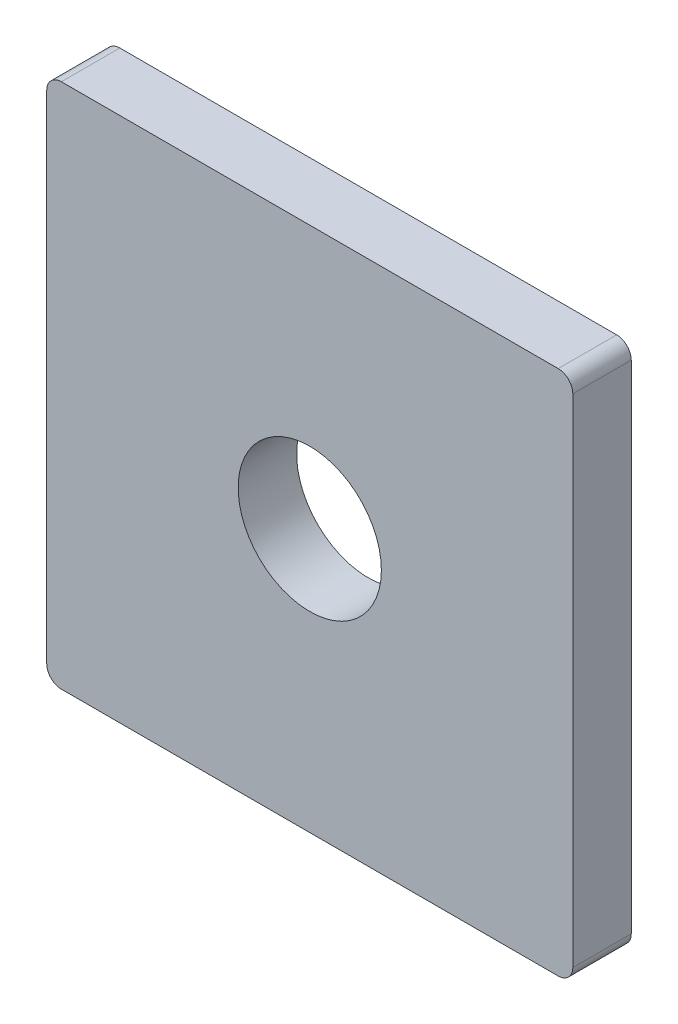
ISO-10303-21;
HEADER;
FILE_DESCRIPTION(('STEP AP214'),'2;1');
FILE_NAME('part.step','',(''),(''),'','','');
FILE_SCHEMA(('AUTOMOTIVE_DESIGN { 1 0 10303 214 1 1 1 1 }'));
ENDSEC;
DATA;
#1=APPLICATION_CONTEXT('core data for automotive mechanical design processes');
#2=APPLICATION_PROTOCOL_DEFINITION('international standard','automotive_design',2000,#1);
#3=PRODUCT_CONTEXT('',#1,'mechanical');
#4=PRODUCT('Part','Part','',(#3));
#5=PRODUCT_RELATED_PRODUCT_CATEGORY('part','',(#4));
#6=PRODUCT_DEFINITION_FORMATION('','',#4);
#7=PRODUCT_DEFINITION_CONTEXT('part definition',#1,'design');
#8=PRODUCT_DEFINITION('design','',#6,#7);
#9=PRODUCT_DEFINITION_SHAPE('','',#8);
#10=(LENGTH_UNIT() NAMED_UNIT(*) SI_UNIT(.MILLI.,.METRE.));
#11=(NAMED_UNIT(*) PLANE_ANGLE_UNIT() SI_UNIT($,.RADIAN.));
#12=(NAMED_UNIT(*) SI_UNIT($,.STERADIAN.) SOLID_ANGLE_UNIT());
#13=UNCERTAINTY_MEASURE_WITH_UNIT(LENGTH_MEASURE(1.E-05),#10,'distance_accuracy_value','');
#14=(GEOMETRIC_REPRESENTATION_CONTEXT(3) GLOBAL_UNCERTAINTY_ASSIGNED_CONTEXT((#13)) GLOBAL_UNIT_ASSIGNED_CONTEXT((#10,
#11,#12)) REPRESENTATION_CONTEXT('',''));
#15=CARTESIAN_POINT('',(0.,0.,0.));
#16=DIRECTION('',(0.,0.,1.));
#17=DIRECTION('',(1.,0.,0.));
#18=AXIS2_PLACEMENT_3D('',#15,#16,#17);
#19=CARTESIAN_POINT('',(0.,0.,2.));
#20=DIRECTION('',(0.,0.,1.));
#21=DIRECTION('',(1.,0.,0.));
#22=AXIS2_PLACEMENT_3D('',#19,#20,#21);
#23=PLANE('',#22);
#24=DIRECTION('',(0.,-1.,0.));
#25=VECTOR('',#24,1.);
#26=CARTESIAN_POINT('',(-9.,9.,2.));
#27=LINE('',#26,#25);
#28=CARTESIAN_POINT('',(-9.,8.5,2.));
#29=VERTEX_POINT('',#28);
#30=CARTESIAN_POINT('',(-9.,-8.5,2.));
#31=VERTEX_POINT('',#30);
#32=EDGE_CURVE('E171',#29,#31,#27,.T.);
#33=ORIENTED_EDGE('',*,*,#32,.T.);
#34=CARTESIAN_POINT('',(-8.5,-8.5,2.));
#35=DIRECTION('',(0.,0.,1.));
#36=DIRECTION('',(1.,0.,0.));
#37=AXIS2_PLACEMENT_3D('',#34,#35,#36);
#38=CIRCLE('',#37,0.5);
#39=CARTESIAN_POINT('',(-8.5,-9.,2.));
#40=VERTEX_POINT('',#39);
#41=EDGE_CURVE('E148',#31,#40,#38,.T.);
#42=ORIENTED_EDGE('',*,*,#41,.T.);
#43=DIRECTION('',(1.,0.,0.));
#44=VECTOR('',#43,1.);
#45=CARTESIAN_POINT('',(-9.,-9.,2.));
#46=LINE('',#45,#44);
#47=CARTESIAN_POINT('',(8.5,-9.,2.));
#48=VERTEX_POINT('',#47);
#49=EDGE_CURVE('E119',#40,#48,#46,.T.);
#50=ORIENTED_EDGE('',*,*,#49,.T.);
#51=CARTESIAN_POINT('',(8.5,-8.5,2.));
#52=DIRECTION('',(0.,0.,1.));
#53=DIRECTION('',(1.,0.,0.));
#54=AXIS2_PLACEMENT_3D('',#51,#52,#53);
#55=CIRCLE('',#54,0.5);
#56=CARTESIAN_POINT('',(9.,-8.5,2.));
#57=VERTEX_POINT('',#56);
#58=EDGE_CURVE('E144',#48,#57,#55,.T.);
#59=ORIENTED_EDGE('',*,*,#58,.T.);
#60=DIRECTION('',(0.,1.,0.));
#61=VECTOR('',#60,1.);
#62=CARTESIAN_POINT('',(9.,9.,2.));
#63=LINE('',#62,#61);
#64=CARTESIAN_POINT('',(9.,8.5,2.));
#65=VERTEX_POINT('',#64);
#66=EDGE_CURVE('E127',#57,#65,#63,.T.);
#67=ORIENTED_EDGE('',*,*,#66,.T.);
#68=CARTESIAN_POINT('',(8.49999999999999,8.5,2.));
#69=DIRECTION('',(0.,0.,1.));
#70=DIRECTION('',(1.,0.,0.));
#71=AXIS2_PLACEMENT_3D('',#68,#69,#70);
#72=CIRCLE('',#71,0.5);
#73=CARTESIAN_POINT('',(8.49999999999999,9.,2.));
#74=VERTEX_POINT('',#73);
#75=EDGE_CURVE('E54',#65,#74,#72,.T.);
#76=ORIENTED_EDGE('',*,*,#75,.T.);
#77=DIRECTION('',(-1.,0.,0.));
#78=VECTOR('',#77,1.);
#79=CARTESIAN_POINT('',(-9.,9.,2.));
#80=LINE('',#79,#78);
#81=CARTESIAN_POINT('',(-8.5,9.,2.));
#82=VERTEX_POINT('',#81);
#83=EDGE_CURVE('E130',#74,#82,#80,.T.);
#84=ORIENTED_EDGE('',*,*,#83,.T.);
#85=CARTESIAN_POINT('',(-8.5,8.5,2.));
#86=DIRECTION('',(0.,0.,1.));
#87=DIRECTION('',(1.,0.,0.));
#88=AXIS2_PLACEMENT_3D('',#85,#86,#87);
#89=CIRCLE('',#88,0.5);
#90=EDGE_CURVE('E146',#82,#29,#89,.T.);
#91=ORIENTED_EDGE('',*,*,#90,.T.);
#92=EDGE_LOOP('',(#33,#42,#50,#59,#67,#76,#84,#91));
#93=FACE_BOUND('',#92,.T.);
#94=CARTESIAN_POINT('',(0.,0.,2.));
#95=DIRECTION('',(0.,0.,1.));
#96=DIRECTION('',(1.,0.,0.));
#97=AXIS2_PLACEMENT_3D('',#94,#95,#96);
#98=CIRCLE('',#97,2.45);
#99=CARTESIAN_POINT('',(2.45,0.,2.));
#100=VERTEX_POINT('',#99);
#101=EDGE_CURVE('E167',#100,#100,#98,.T.);
#102=ORIENTED_EDGE('',*,*,#101,.F.);
#103=EDGE_LOOP('',(#102));
#104=FACE_BOUND('',#103,.T.);
#105=ADVANCED_FACE('F32',(#93,#104),#23,.T.);
#106=CARTESIAN_POINT('',(0.,0.,0.));
#107=DIRECTION('',(0.,0.,1.));
#108=DIRECTION('',(1.,0.,0.));
#109=AXIS2_PLACEMENT_3D('',#106,#107,#108);
#110=PLANE('',#109);
#111=DIRECTION('',(1.,0.,0.));
#112=VECTOR('',#111,1.);
#113=CARTESIAN_POINT('',(-9.,-9.,0.));
#114=LINE('',#113,#112);
#115=CARTESIAN_POINT('',(-8.5,-9.,0.));
#116=VERTEX_POINT('',#115);
#117=CARTESIAN_POINT('',(8.5,-9.,0.));
#118=VERTEX_POINT('',#117);
#119=EDGE_CURVE('E116',#116,#118,#114,.T.);
#120=ORIENTED_EDGE('',*,*,#119,.F.);
#121=CARTESIAN_POINT('',(-8.5,-8.5,0.));
#122=DIRECTION('',(0.,0.,1.));
#123=DIRECTION('',(1.,0.,0.));
#124=AXIS2_PLACEMENT_3D('',#121,#122,#123);
#125=CIRCLE('',#124,0.5);
#126=CARTESIAN_POINT('',(-9.,-8.5,0.));
#127=VERTEX_POINT('',#126);
#128=EDGE_CURVE('E99',#116,#127,#125,.F.);
#129=ORIENTED_EDGE('',*,*,#128,.T.);
#130=DIRECTION('',(0.,-1.,0.));
#131=VECTOR('',#130,1.);
#132=CARTESIAN_POINT('',(-9.,9.,0.));
#133=LINE('',#132,#131);
#134=CARTESIAN_POINT('',(-9.,8.5,0.));
#135=VERTEX_POINT('',#134);
#136=EDGE_CURVE('E128',#135,#127,#133,.T.);
#137=ORIENTED_EDGE('',*,*,#136,.F.);
#138=CARTESIAN_POINT('',(-8.5,8.5,0.));
#139=DIRECTION('',(0.,0.,1.));
#140=DIRECTION('',(1.,0.,0.));
#141=AXIS2_PLACEMENT_3D('',#138,#139,#140);
#142=CIRCLE('',#141,0.5);
#143=CARTESIAN_POINT('',(-8.5,9.,0.));
#144=VERTEX_POINT('',#143);
#145=EDGE_CURVE('E110',#135,#144,#142,.F.);
#146=ORIENTED_EDGE('',*,*,#145,.T.);
#147=DIRECTION('',(-1.,0.,0.));
#148=VECTOR('',#147,1.);
#149=CARTESIAN_POINT('',(-9.,9.,0.));
#150=LINE('',#149,#148);
#151=CARTESIAN_POINT('',(8.49999999999999,9.,0.));
#152=VERTEX_POINT('',#151);
#153=EDGE_CURVE('E132',#152,#144,#150,.T.);
#154=ORIENTED_EDGE('',*,*,#153,.F.);
#155=CARTESIAN_POINT('',(8.49999999999999,8.5,0.));
#156=DIRECTION('',(0.,0.,1.));
#157=DIRECTION('',(1.,0.,0.));
#158=AXIS2_PLACEMENT_3D('',#155,#156,#157);
#159=CIRCLE('',#158,0.5);
#160=CARTESIAN_POINT('',(9.,8.5,0.));
#161=VERTEX_POINT('',#160);
#162=EDGE_CURVE('E120',#152,#161,#159,.F.);
#163=ORIENTED_EDGE('',*,*,#162,.T.);
#164=DIRECTION('',(0.,1.,0.));
#165=VECTOR('',#164,1.);
#166=CARTESIAN_POINT('',(9.,9.,0.));
#167=LINE('',#166,#165);
#168=CARTESIAN_POINT('',(9.,-8.5,0.));
#169=VERTEX_POINT('',#168);
#170=EDGE_CURVE('E159',#169,#161,#167,.T.);
#171=ORIENTED_EDGE('',*,*,#170,.F.);
#172=CARTESIAN_POINT('',(8.5,-8.5,0.));
#173=DIRECTION('',(0.,0.,1.));
#174=DIRECTION('',(1.,0.,0.));
#175=AXIS2_PLACEMENT_3D('',#172,#173,#174);
#176=CIRCLE('',#175,0.5);
#177=EDGE_CURVE('E126',#169,#118,#176,.F.);
#178=ORIENTED_EDGE('',*,*,#177,.T.);
#179=EDGE_LOOP('',(#120,#129,#137,#146,#154,#163,#171,#178));
#180=FACE_BOUND('',#179,.T.);
#181=CARTESIAN_POINT('',(0.,0.,0.));
#182=DIRECTION('',(0.,0.,1.));
#183=DIRECTION('',(1.,0.,0.));
#184=AXIS2_PLACEMENT_3D('',#181,#182,#183);
#185=CIRCLE('',#184,2.45);
#186=CARTESIAN_POINT('',(2.45,0.,0.));
#187=VERTEX_POINT('',#186);
#188=EDGE_CURVE('E174',#187,#187,#185,.T.);
#189=ORIENTED_EDGE('',*,*,#188,.T.);
#190=EDGE_LOOP('',(#189));
#191=FACE_BOUND('',#190,.T.);
#192=ADVANCED_FACE('F123',(#180,#191),#110,.F.);
#193=CARTESIAN_POINT('',(9.,9.,2.));
#194=DIRECTION('',(-1.,0.,0.));
#195=DIRECTION('',(0.,-1.,0.));
#196=AXIS2_PLACEMENT_3D('',#193,#194,#195);
#197=PLANE('',#196);
#198=ORIENTED_EDGE('',*,*,#66,.F.);
#199=DIRECTION('',(0.,0.,-1.));
#200=VECTOR('',#199,1.);
#201=CARTESIAN_POINT('',(9.,-8.5,2.));
#202=LINE('',#201,#200);
#203=EDGE_CURVE('E11',#57,#169,#202,.T.);
#204=ORIENTED_EDGE('',*,*,#203,.T.);
#205=ORIENTED_EDGE('',*,*,#170,.T.);
#206=DIRECTION('',(0.,0.,-1.));
#207=VECTOR('',#206,1.);
#208=CARTESIAN_POINT('',(9.,8.5,2.));
#209=LINE('',#208,#207);
#210=EDGE_CURVE('E40',#161,#65,#209,.F.);
#211=ORIENTED_EDGE('',*,*,#210,.T.);
#212=EDGE_LOOP('',(#198,#204,#205,#211));
#213=FACE_BOUND('',#212,.T.);
#214=ADVANCED_FACE('F157',(#213),#197,.F.);
#215=CARTESIAN_POINT('',(-9.,9.,2.));
#216=DIRECTION('',(0.,-1.,0.));
#217=DIRECTION('',(0.,0.,-1.));
#218=AXIS2_PLACEMENT_3D('',#215,#216,#217);
#219=PLANE('',#218);
#220=ORIENTED_EDGE('',*,*,#153,.T.);
#221=DIRECTION('',(0.,0.,-1.));
#222=VECTOR('',#221,1.);
#223=CARTESIAN_POINT('',(-8.5,9.,2.));
#224=LINE('',#223,#222);
#225=EDGE_CURVE('E47',#144,#82,#224,.F.);
#226=ORIENTED_EDGE('',*,*,#225,.T.);
#227=ORIENTED_EDGE('',*,*,#83,.F.);
#228=DIRECTION('',(0.,0.,-1.));
#229=VECTOR('',#228,1.);
#230=CARTESIAN_POINT('',(8.49999999999999,9.,2.));
#231=LINE('',#230,#229);
#232=EDGE_CURVE('E150',#74,#152,#231,.T.);
#233=ORIENTED_EDGE('',*,*,#232,.T.);
#234=EDGE_LOOP('',(#220,#226,#227,#233));
#235=FACE_BOUND('',#234,.T.);
#236=ADVANCED_FACE('F166',(#235),#219,.F.);
#237=CARTESIAN_POINT('',(-9.,9.,2.));
#238=DIRECTION('',(1.,0.,0.));
#239=DIRECTION('',(0.,1.,0.));
#240=AXIS2_PLACEMENT_3D('',#237,#238,#239);
#241=PLANE('',#240);
#242=ORIENTED_EDGE('',*,*,#136,.T.);
#243=DIRECTION('',(0.,0.,-1.));
#244=VECTOR('',#243,1.);
#245=CARTESIAN_POINT('',(-9.,-8.5,2.));
#246=LINE('',#245,#244);
#247=EDGE_CURVE('E104',#127,#31,#246,.F.);
#248=ORIENTED_EDGE('',*,*,#247,.T.);
#249=ORIENTED_EDGE('',*,*,#32,.F.);
#250=DIRECTION('',(0.,0.,-1.));
#251=VECTOR('',#250,1.);
#252=CARTESIAN_POINT('',(-9.,8.5,2.));
#253=LINE('',#252,#251);
#254=EDGE_CURVE('E109',#29,#135,#253,.T.);
#255=ORIENTED_EDGE('',*,*,#254,.T.);
#256=EDGE_LOOP('',(#242,#248,#249,#255));
#257=FACE_BOUND('',#256,.T.);
#258=ADVANCED_FACE('F192',(#257),#241,.F.);
#259=CARTESIAN_POINT('',(-9.,-9.,2.));
#260=DIRECTION('',(0.,1.,0.));
#261=DIRECTION('',(0.,0.,1.));
#262=AXIS2_PLACEMENT_3D('',#259,#260,#261);
#263=PLANE('',#262);
#264=ORIENTED_EDGE('',*,*,#49,.F.);
#265=DIRECTION('',(0.,0.,-1.));
#266=VECTOR('',#265,1.);
#267=CARTESIAN_POINT('',(-8.5,-9.,2.));
#268=LINE('',#267,#266);
#269=EDGE_CURVE('E103',#40,#116,#268,.T.);
#270=ORIENTED_EDGE('',*,*,#269,.T.);
#271=ORIENTED_EDGE('',*,*,#119,.T.);
#272=DIRECTION('',(0.,0.,-1.));
#273=VECTOR('',#272,1.);
#274=CARTESIAN_POINT('',(8.5,-9.,2.));
#275=LINE('',#274,#273);
#276=EDGE_CURVE('E121',#118,#48,#275,.F.);
#277=ORIENTED_EDGE('',*,*,#276,.T.);
#278=EDGE_LOOP('',(#264,#270,#271,#277));
#279=FACE_BOUND('',#278,.T.);
#280=ADVANCED_FACE('F115',(#279),#263,.F.);
#281=CARTESIAN_POINT('',(0.,0.,2.));
#282=DIRECTION('',(0.,0.,-1.));
#283=DIRECTION('',(-1.,0.,0.));
#284=AXIS2_PLACEMENT_3D('',#281,#282,#283);
#285=CYLINDRICAL_SURFACE('',#284,2.45);
#286=ORIENTED_EDGE('',*,*,#101,.T.);
#287=EDGE_LOOP('',(#286));
#288=FACE_BOUND('',#287,.T.);
#289=ORIENTED_EDGE('',*,*,#188,.F.);
#290=EDGE_LOOP('',(#289));
#291=FACE_BOUND('',#290,.T.);
#292=ADVANCED_FACE('F180',(#288,#291),#285,.F.);
#293=CARTESIAN_POINT('',(-8.5,-8.5,2.));
#294=DIRECTION('',(0.,0.,-1.));
#295=DIRECTION('',(-1.,0.,0.));
#296=AXIS2_PLACEMENT_3D('',#293,#294,#295);
#297=CYLINDRICAL_SURFACE('',#296,0.5);
#298=ORIENTED_EDGE('',*,*,#41,.F.);
#299=ORIENTED_EDGE('',*,*,#247,.F.);
#300=ORIENTED_EDGE('',*,*,#128,.F.);
#301=ORIENTED_EDGE('',*,*,#269,.F.);
#302=EDGE_LOOP('',(#298,#299,#300,#301));
#303=FACE_BOUND('',#302,.T.);
#304=ADVANCED_FACE('F102',(#303),#297,.T.);
#305=CARTESIAN_POINT('',(-8.5,8.5,2.));
#306=DIRECTION('',(0.,0.,-1.));
#307=DIRECTION('',(-1.,0.,0.));
#308=AXIS2_PLACEMENT_3D('',#305,#306,#307);
#309=CYLINDRICAL_SURFACE('',#308,0.5);
#310=ORIENTED_EDGE('',*,*,#90,.F.);
#311=ORIENTED_EDGE('',*,*,#225,.F.);
#312=ORIENTED_EDGE('',*,*,#145,.F.);
#313=ORIENTED_EDGE('',*,*,#254,.F.);
#314=EDGE_LOOP('',(#310,#311,#312,#313));
#315=FACE_BOUND('',#314,.T.);
#316=ADVANCED_FACE('F202',(#315),#309,.T.);
#317=CARTESIAN_POINT('',(8.5,-8.5,2.));
#318=DIRECTION('',(0.,0.,-1.));
#319=DIRECTION('',(-1.,0.,0.));
#320=AXIS2_PLACEMENT_3D('',#317,#318,#319);
#321=CYLINDRICAL_SURFACE('',#320,0.5);
#322=ORIENTED_EDGE('',*,*,#58,.F.);
#323=ORIENTED_EDGE('',*,*,#276,.F.);
#324=ORIENTED_EDGE('',*,*,#177,.F.);
#325=ORIENTED_EDGE('',*,*,#203,.F.);
#326=EDGE_LOOP('',(#322,#323,#324,#325));
#327=FACE_BOUND('',#326,.T.);
#328=ADVANCED_FACE('F204',(#327),#321,.T.);
#329=CARTESIAN_POINT('',(8.49999999999999,8.5,2.));
#330=DIRECTION('',(0.,0.,-1.));
#331=DIRECTION('',(-1.,0.,0.));
#332=AXIS2_PLACEMENT_3D('',#329,#330,#331);
#333=CYLINDRICAL_SURFACE('',#332,0.5);
#334=ORIENTED_EDGE('',*,*,#75,.F.);
#335=ORIENTED_EDGE('',*,*,#210,.F.);
#336=ORIENTED_EDGE('',*,*,#162,.F.);
#337=ORIENTED_EDGE('',*,*,#232,.F.);
#338=EDGE_LOOP('',(#334,#335,#336,#337));
#339=FACE_BOUND('',#338,.T.);
#340=ADVANCED_FACE('F34',(#339),#333,.T.);
#341=CLOSED_SHELL('',(#105,#192,#214,#236,#258,#280,#292,#304,#316,#328,#340));
#342=MANIFOLD_SOLID_BREP('B2',#341);
#343=ADVANCED_BREP_SHAPE_REPRESENTATION('',(#18,#342),#14);
#344=SHAPE_DEFINITION_REPRESENTATION(#9,#343);
ENDSEC;
END-ISO-10303-21;
